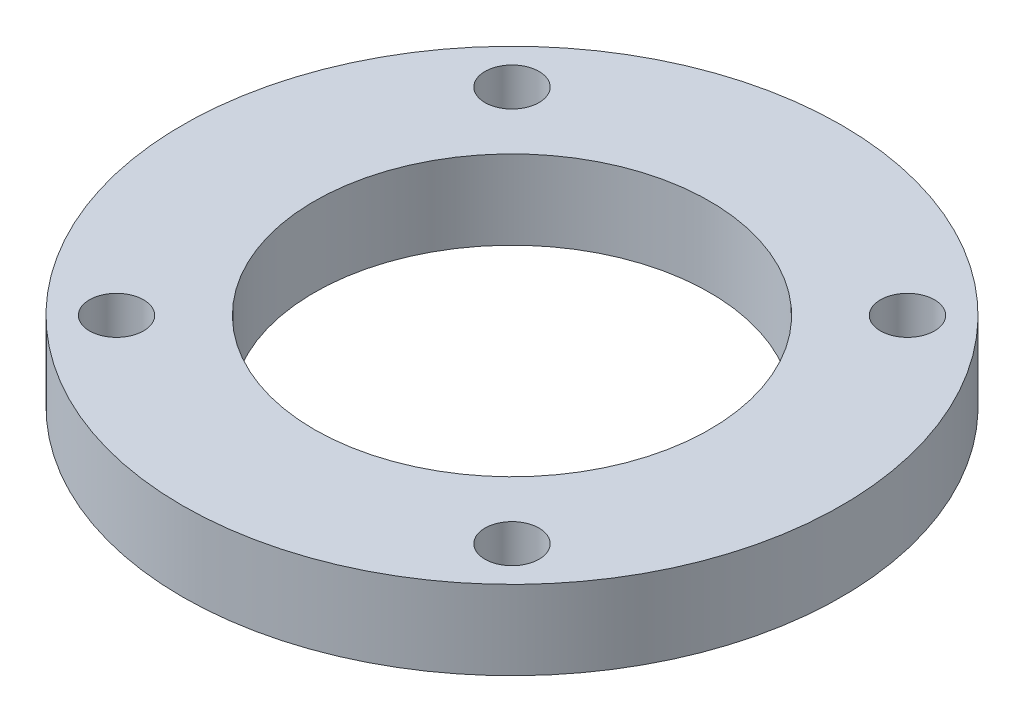
ISO-10303-21;
HEADER;
FILE_DESCRIPTION(('STEP AP214'),'2;1');
FILE_NAME('part.step','',(''),(''),'','','');
FILE_SCHEMA(('AUTOMOTIVE_DESIGN { 1 0 10303 214 1 1 1 1 }'));
ENDSEC;
DATA;
#1=APPLICATION_CONTEXT('core data for automotive mechanical design processes');
#2=APPLICATION_PROTOCOL_DEFINITION('international standard','automotive_design',2000,#1);
#3=PRODUCT_CONTEXT('',#1,'mechanical');
#4=PRODUCT('Part','Part','',(#3));
#5=PRODUCT_RELATED_PRODUCT_CATEGORY('part','',(#4));
#6=PRODUCT_DEFINITION_FORMATION('','',#4);
#7=PRODUCT_DEFINITION_CONTEXT('part definition',#1,'design');
#8=PRODUCT_DEFINITION('design','',#6,#7);
#9=PRODUCT_DEFINITION_SHAPE('','',#8);
#10=(LENGTH_UNIT() NAMED_UNIT(*) SI_UNIT(.MILLI.,.METRE.));
#11=(NAMED_UNIT(*) PLANE_ANGLE_UNIT() SI_UNIT($,.RADIAN.));
#12=(NAMED_UNIT(*) SI_UNIT($,.STERADIAN.) SOLID_ANGLE_UNIT());
#13=UNCERTAINTY_MEASURE_WITH_UNIT(LENGTH_MEASURE(1.E-05),#10,'distance_accuracy_value','');
#14=(GEOMETRIC_REPRESENTATION_CONTEXT(3) GLOBAL_UNCERTAINTY_ASSIGNED_CONTEXT((#13)) GLOBAL_UNIT_ASSIGNED_CONTEXT((#10,
#11,#12)) REPRESENTATION_CONTEXT('',''));
#15=CARTESIAN_POINT('',(0.,0.,0.));
#16=DIRECTION('',(0.,0.,1.));
#17=DIRECTION('',(1.,0.,0.));
#18=AXIS2_PLACEMENT_3D('',#15,#16,#17);
#19=CARTESIAN_POINT('',(0.,6.,0.));
#20=DIRECTION('',(0.,1.,0.));
#21=DIRECTION('',(0.,0.,1.));
#22=AXIS2_PLACEMENT_3D('',#19,#20,#21);
#23=PLANE('',#22);
#24=CARTESIAN_POINT('',(0.,6.,0.));
#25=DIRECTION('',(0.,1.,0.));
#26=DIRECTION('',(0.,0.,1.));
#27=AXIS2_PLACEMENT_3D('',#24,#25,#26);
#28=CIRCLE('',#27,15.);
#29=CARTESIAN_POINT('',(0.,6.,15.));
#30=VERTEX_POINT('',#29);
#31=EDGE_CURVE('E74',#30,#30,#28,.T.);
#32=ORIENTED_EDGE('',*,*,#31,.F.);
#33=EDGE_LOOP('',(#32));
#34=FACE_BOUND('',#33,.T.);
#35=CARTESIAN_POINT('',(15.,6.,15.));
#36=DIRECTION('',(0.,1.,0.));
#37=DIRECTION('',(0.,0.,1.));
#38=AXIS2_PLACEMENT_3D('',#35,#36,#37);
#39=CIRCLE('',#38,2.05);
#40=CARTESIAN_POINT('',(15.,6.,17.05));
#41=VERTEX_POINT('',#40);
#42=EDGE_CURVE('E59',#41,#41,#39,.T.);
#43=ORIENTED_EDGE('',*,*,#42,.F.);
#44=EDGE_LOOP('',(#43));
#45=FACE_BOUND('',#44,.T.);
#46=CARTESIAN_POINT('',(-15.,6.,-15.));
#47=DIRECTION('',(0.,1.,0.));
#48=DIRECTION('',(0.,0.,1.));
#49=AXIS2_PLACEMENT_3D('',#46,#47,#48);
#50=CIRCLE('',#49,2.05);
#51=CARTESIAN_POINT('',(-15.,6.,-12.95));
#52=VERTEX_POINT('',#51);
#53=EDGE_CURVE('E48',#52,#52,#50,.T.);
#54=ORIENTED_EDGE('',*,*,#53,.F.);
#55=EDGE_LOOP('',(#54));
#56=FACE_BOUND('',#55,.T.);
#57=CARTESIAN_POINT('',(0.,6.,0.));
#58=DIRECTION('',(0.,1.,0.));
#59=DIRECTION('',(0.,0.,1.));
#60=AXIS2_PLACEMENT_3D('',#57,#58,#59);
#61=CIRCLE('',#60,25.);
#62=CARTESIAN_POINT('',(0.,6.,25.));
#63=VERTEX_POINT('',#62);
#64=EDGE_CURVE('E10',#63,#63,#61,.T.);
#65=ORIENTED_EDGE('',*,*,#64,.T.);
#66=EDGE_LOOP('',(#65));
#67=FACE_BOUND('',#66,.T.);
#68=CARTESIAN_POINT('',(15.,6.,-15.));
#69=DIRECTION('',(0.,1.,0.));
#70=DIRECTION('',(0.,0.,1.));
#71=AXIS2_PLACEMENT_3D('',#68,#69,#70);
#72=CIRCLE('',#71,2.05);
#73=CARTESIAN_POINT('',(15.,6.,-12.95));
#74=VERTEX_POINT('',#73);
#75=EDGE_CURVE('E53',#74,#74,#72,.T.);
#76=ORIENTED_EDGE('',*,*,#75,.F.);
#77=EDGE_LOOP('',(#76));
#78=FACE_BOUND('',#77,.T.);
#79=CARTESIAN_POINT('',(-15.,6.,15.));
#80=DIRECTION('',(0.,1.,0.));
#81=DIRECTION('',(0.,0.,1.));
#82=AXIS2_PLACEMENT_3D('',#79,#80,#81);
#83=CIRCLE('',#82,2.05);
#84=CARTESIAN_POINT('',(-15.,6.,17.05));
#85=VERTEX_POINT('',#84);
#86=EDGE_CURVE('E65',#85,#85,#83,.T.);
#87=ORIENTED_EDGE('',*,*,#86,.F.);
#88=EDGE_LOOP('',(#87));
#89=FACE_BOUND('',#88,.T.);
#90=ADVANCED_FACE('F37',(#34,#45,#56,#67,#78,#89),#23,.T.);
#91=CARTESIAN_POINT('',(0.,0.,0.));
#92=DIRECTION('',(0.,1.,0.));
#93=DIRECTION('',(0.,0.,1.));
#94=AXIS2_PLACEMENT_3D('',#91,#92,#93);
#95=PLANE('',#94);
#96=CARTESIAN_POINT('',(0.,0.,0.));
#97=DIRECTION('',(0.,1.,0.));
#98=DIRECTION('',(0.,0.,1.));
#99=AXIS2_PLACEMENT_3D('',#96,#97,#98);
#100=CIRCLE('',#99,15.);
#101=CARTESIAN_POINT('',(0.,0.,15.));
#102=VERTEX_POINT('',#101);
#103=EDGE_CURVE('E71',#102,#102,#100,.T.);
#104=ORIENTED_EDGE('',*,*,#103,.T.);
#105=EDGE_LOOP('',(#104));
#106=FACE_BOUND('',#105,.T.);
#107=CARTESIAN_POINT('',(0.,0.,0.));
#108=DIRECTION('',(0.,1.,0.));
#109=DIRECTION('',(0.,0.,1.));
#110=AXIS2_PLACEMENT_3D('',#107,#108,#109);
#111=CIRCLE('',#110,25.);
#112=CARTESIAN_POINT('',(0.,0.,25.));
#113=VERTEX_POINT('',#112);
#114=EDGE_CURVE('E41',#113,#113,#111,.T.);
#115=ORIENTED_EDGE('',*,*,#114,.F.);
#116=EDGE_LOOP('',(#115));
#117=FACE_BOUND('',#116,.T.);
#118=CARTESIAN_POINT('',(-15.,0.,-15.));
#119=DIRECTION('',(0.,1.,0.));
#120=DIRECTION('',(0.,0.,1.));
#121=AXIS2_PLACEMENT_3D('',#118,#119,#120);
#122=CIRCLE('',#121,2.05);
#123=CARTESIAN_POINT('',(-15.,0.,-12.95));
#124=VERTEX_POINT('',#123);
#125=EDGE_CURVE('E50',#124,#124,#122,.T.);
#126=ORIENTED_EDGE('',*,*,#125,.T.);
#127=EDGE_LOOP('',(#126));
#128=FACE_BOUND('',#127,.T.);
#129=CARTESIAN_POINT('',(15.,0.,-15.));
#130=DIRECTION('',(0.,1.,0.));
#131=DIRECTION('',(0.,0.,1.));
#132=AXIS2_PLACEMENT_3D('',#129,#130,#131);
#133=CIRCLE('',#132,2.05);
#134=CARTESIAN_POINT('',(15.,0.,-12.95));
#135=VERTEX_POINT('',#134);
#136=EDGE_CURVE('E56',#135,#135,#133,.T.);
#137=ORIENTED_EDGE('',*,*,#136,.T.);
#138=EDGE_LOOP('',(#137));
#139=FACE_BOUND('',#138,.T.);
#140=CARTESIAN_POINT('',(15.,0.,15.));
#141=DIRECTION('',(0.,1.,0.));
#142=DIRECTION('',(0.,0.,1.));
#143=AXIS2_PLACEMENT_3D('',#140,#141,#142);
#144=CIRCLE('',#143,2.05);
#145=CARTESIAN_POINT('',(15.,0.,17.05));
#146=VERTEX_POINT('',#145);
#147=EDGE_CURVE('E62',#146,#146,#144,.T.);
#148=ORIENTED_EDGE('',*,*,#147,.T.);
#149=EDGE_LOOP('',(#148));
#150=FACE_BOUND('',#149,.T.);
#151=CARTESIAN_POINT('',(-15.,0.,15.));
#152=DIRECTION('',(0.,1.,0.));
#153=DIRECTION('',(0.,0.,1.));
#154=AXIS2_PLACEMENT_3D('',#151,#152,#153);
#155=CIRCLE('',#154,2.05);
#156=CARTESIAN_POINT('',(-15.,0.,17.05));
#157=VERTEX_POINT('',#156);
#158=EDGE_CURVE('E68',#157,#157,#155,.T.);
#159=ORIENTED_EDGE('',*,*,#158,.T.);
#160=EDGE_LOOP('',(#159));
#161=FACE_BOUND('',#160,.T.);
#162=ADVANCED_FACE('F80',(#106,#117,#128,#139,#150,#161),#95,.F.);
#163=CARTESIAN_POINT('',(0.,6.,0.));
#164=DIRECTION('',(0.,-1.,0.));
#165=DIRECTION('',(0.,0.,-1.));
#166=AXIS2_PLACEMENT_3D('',#163,#164,#165);
#167=CYLINDRICAL_SURFACE('',#166,25.);
#168=ORIENTED_EDGE('',*,*,#64,.F.);
#169=EDGE_LOOP('',(#168));
#170=FACE_BOUND('',#169,.T.);
#171=ORIENTED_EDGE('',*,*,#114,.T.);
#172=EDGE_LOOP('',(#171));
#173=FACE_BOUND('',#172,.T.);
#174=ADVANCED_FACE('F39',(#170,#173),#167,.T.);
#175=CARTESIAN_POINT('',(-15.,6.,-15.));
#176=DIRECTION('',(0.,-1.,0.));
#177=DIRECTION('',(0.,0.,-1.));
#178=AXIS2_PLACEMENT_3D('',#175,#176,#177);
#179=CYLINDRICAL_SURFACE('',#178,2.05);
#180=ORIENTED_EDGE('',*,*,#53,.T.);
#181=EDGE_LOOP('',(#180));
#182=FACE_BOUND('',#181,.T.);
#183=ORIENTED_EDGE('',*,*,#125,.F.);
#184=EDGE_LOOP('',(#183));
#185=FACE_BOUND('',#184,.T.);
#186=ADVANCED_FACE('F111',(#182,#185),#179,.F.);
#187=CARTESIAN_POINT('',(15.,6.,-15.));
#188=DIRECTION('',(0.,-1.,0.));
#189=DIRECTION('',(0.,0.,-1.));
#190=AXIS2_PLACEMENT_3D('',#187,#188,#189);
#191=CYLINDRICAL_SURFACE('',#190,2.05);
#192=ORIENTED_EDGE('',*,*,#75,.T.);
#193=EDGE_LOOP('',(#192));
#194=FACE_BOUND('',#193,.T.);
#195=ORIENTED_EDGE('',*,*,#136,.F.);
#196=EDGE_LOOP('',(#195));
#197=FACE_BOUND('',#196,.T.);
#198=ADVANCED_FACE('F116',(#194,#197),#191,.F.);
#199=CARTESIAN_POINT('',(15.,6.,15.));
#200=DIRECTION('',(0.,-1.,0.));
#201=DIRECTION('',(0.,0.,-1.));
#202=AXIS2_PLACEMENT_3D('',#199,#200,#201);
#203=CYLINDRICAL_SURFACE('',#202,2.05);
#204=ORIENTED_EDGE('',*,*,#42,.T.);
#205=EDGE_LOOP('',(#204));
#206=FACE_BOUND('',#205,.T.);
#207=ORIENTED_EDGE('',*,*,#147,.F.);
#208=EDGE_LOOP('',(#207));
#209=FACE_BOUND('',#208,.T.);
#210=ADVANCED_FACE('F103',(#206,#209),#203,.F.);
#211=CARTESIAN_POINT('',(-15.,6.,15.));
#212=DIRECTION('',(0.,-1.,0.));
#213=DIRECTION('',(0.,0.,-1.));
#214=AXIS2_PLACEMENT_3D('',#211,#212,#213);
#215=CYLINDRICAL_SURFACE('',#214,2.05);
#216=ORIENTED_EDGE('',*,*,#86,.T.);
#217=EDGE_LOOP('',(#216));
#218=FACE_BOUND('',#217,.T.);
#219=ORIENTED_EDGE('',*,*,#158,.F.);
#220=EDGE_LOOP('',(#219));
#221=FACE_BOUND('',#220,.T.);
#222=ADVANCED_FACE('F86',(#218,#221),#215,.F.);
#223=CARTESIAN_POINT('',(0.,0.,0.));
#224=DIRECTION('',(0.,1.,0.));
#225=DIRECTION('',(0.,0.,1.));
#226=AXIS2_PLACEMENT_3D('',#223,#224,#225);
#227=CYLINDRICAL_SURFACE('',#226,15.);
#228=ORIENTED_EDGE('',*,*,#103,.F.);
#229=EDGE_LOOP('',(#228));
#230=FACE_BOUND('',#229,.T.);
#231=ORIENTED_EDGE('',*,*,#31,.T.);
#232=EDGE_LOOP('',(#231));
#233=FACE_BOUND('',#232,.T.);
#234=ADVANCED_FACE('F83',(#230,#233),#227,.F.);
#235=CLOSED_SHELL('',(#90,#162,#174,#186,#198,#210,#222,#234));
#236=MANIFOLD_SOLID_BREP('B2',#235);
#237=ADVANCED_BREP_SHAPE_REPRESENTATION('',(#18,#236),#14);
#238=SHAPE_DEFINITION_REPRESENTATION(#9,#237);
ENDSEC;
END-ISO-10303-21;
